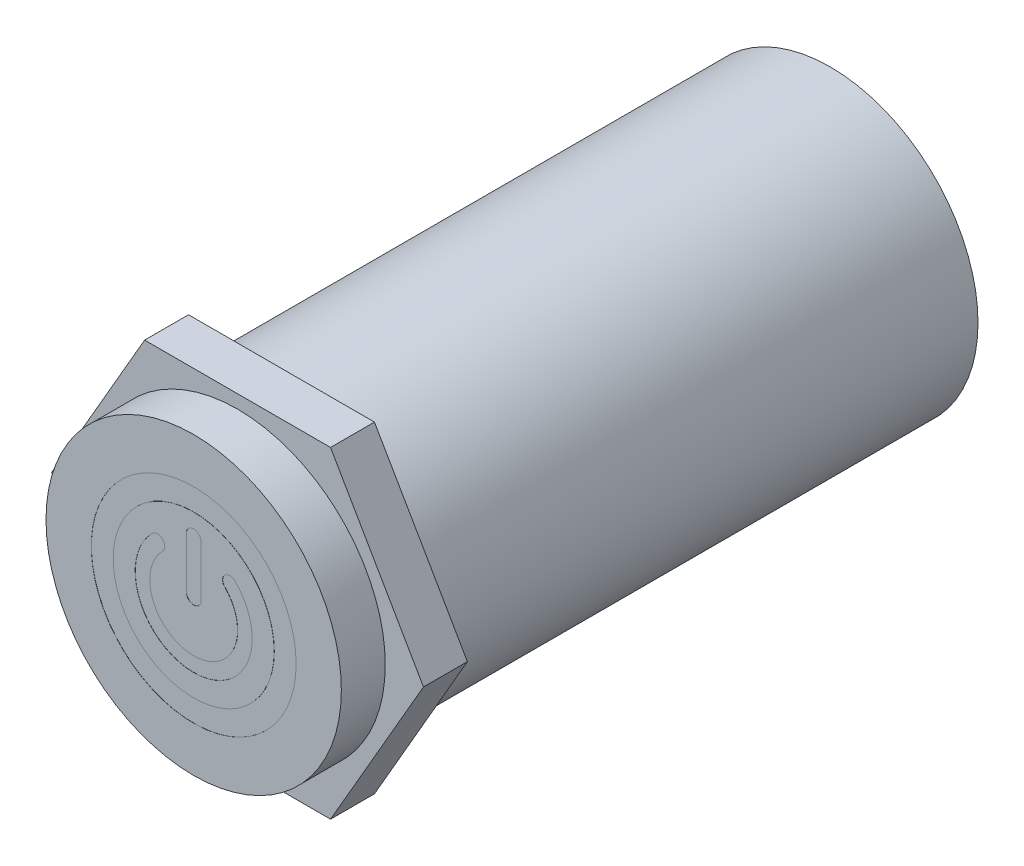
ISO-10303-21;
HEADER;
FILE_DESCRIPTION(('STEP AP214'),'2;1');
FILE_NAME('part.step','',(''),(''),'','','');
FILE_SCHEMA(('AUTOMOTIVE_DESIGN { 1 0 10303 214 1 1 1 1 }'));
ENDSEC;
DATA;
#1=APPLICATION_CONTEXT('core data for automotive mechanical design processes');
#2=APPLICATION_PROTOCOL_DEFINITION('international standard','automotive_design',2000,#1);
#3=PRODUCT_CONTEXT('',#1,'mechanical');
#4=PRODUCT('Part','Part','',(#3));
#5=PRODUCT_RELATED_PRODUCT_CATEGORY('part','',(#4));
#6=PRODUCT_DEFINITION_FORMATION('','',#4);
#7=PRODUCT_DEFINITION_CONTEXT('part definition',#1,'design');
#8=PRODUCT_DEFINITION('design','',#6,#7);
#9=PRODUCT_DEFINITION_SHAPE('','',#8);
#10=(LENGTH_UNIT() NAMED_UNIT(*) SI_UNIT(.MILLI.,.METRE.));
#11=(NAMED_UNIT(*) PLANE_ANGLE_UNIT() SI_UNIT($,.RADIAN.));
#12=(NAMED_UNIT(*) SI_UNIT($,.STERADIAN.) SOLID_ANGLE_UNIT());
#13=UNCERTAINTY_MEASURE_WITH_UNIT(LENGTH_MEASURE(1.E-05),#10,'distance_accuracy_value','');
#14=(GEOMETRIC_REPRESENTATION_CONTEXT(3) GLOBAL_UNCERTAINTY_ASSIGNED_CONTEXT((#13)) GLOBAL_UNIT_ASSIGNED_CONTEXT((#10,
#11,#12)) REPRESENTATION_CONTEXT('',''));
#15=CARTESIAN_POINT('',(0.,0.,0.));
#16=DIRECTION('',(0.,0.,1.));
#17=DIRECTION('',(1.,0.,0.));
#18=AXIS2_PLACEMENT_3D('',#15,#16,#17);
#19=CARTESIAN_POINT('',(0.,0.,6.));
#20=DIRECTION('',(0.,0.,1.));
#21=DIRECTION('',(1.,0.,0.));
#22=AXIS2_PLACEMENT_3D('',#19,#20,#21);
#23=PLANE('',#22);
#24=CARTESIAN_POINT('',(0.,0.500000000000001,6.));
#25=DIRECTION('',(0.,0.,1.));
#26=DIRECTION('',(1.,0.,0.));
#27=AXIS2_PLACEMENT_3D('',#24,#25,#26);
#28=CIRCLE('',#27,0.5);
#29=CARTESIAN_POINT('',(-0.5,0.500000000000001,6.));
#30=VERTEX_POINT('',#29);
#31=CARTESIAN_POINT('',(0.5,0.500000000000001,6.));
#32=VERTEX_POINT('',#31);
#33=EDGE_CURVE('E108',#30,#32,#28,.T.);
#34=ORIENTED_EDGE('',*,*,#33,.F.);
#35=DIRECTION('',(0.,1.,0.));
#36=VECTOR('',#35,1.);
#37=CARTESIAN_POINT('',(-0.5,0.500000000000001,6.));
#38=LINE('',#37,#36);
#39=CARTESIAN_POINT('',(-0.5,4.,6.));
#40=VERTEX_POINT('',#39);
#41=EDGE_CURVE('E204',#30,#40,#38,.T.);
#42=ORIENTED_EDGE('',*,*,#41,.T.);
#43=CARTESIAN_POINT('',(0.,4.,6.));
#44=DIRECTION('',(0.,0.,1.));
#45=DIRECTION('',(1.,0.,0.));
#46=AXIS2_PLACEMENT_3D('',#43,#44,#45);
#47=CIRCLE('',#46,0.5);
#48=CARTESIAN_POINT('',(0.5,4.,6.));
#49=VERTEX_POINT('',#48);
#50=EDGE_CURVE('E210',#49,#40,#47,.T.);
#51=ORIENTED_EDGE('',*,*,#50,.F.);
#52=DIRECTION('',(0.,-1.,0.));
#53=VECTOR('',#52,1.);
#54=CARTESIAN_POINT('',(0.5,4.,6.));
#55=LINE('',#54,#53);
#56=EDGE_CURVE('E215',#49,#32,#55,.T.);
#57=ORIENTED_EDGE('',*,*,#56,.T.);
#58=EDGE_LOOP('',(#34,#42,#51,#57));
#59=FACE_BOUND('',#58,.T.);
#60=CARTESIAN_POINT('',(0.,0.,6.));
#61=DIRECTION('',(0.,0.,1.));
#62=DIRECTION('',(1.,0.,0.));
#63=AXIS2_PLACEMENT_3D('',#60,#61,#62);
#64=CIRCLE('',#63,5.5);
#65=CARTESIAN_POINT('',(5.5,0.,6.));
#66=VERTEX_POINT('',#65);
#67=EDGE_CURVE('E249',#66,#66,#64,.T.);
#68=ORIENTED_EDGE('',*,*,#67,.T.);
#69=EDGE_LOOP('',(#68));
#70=FACE_BOUND('',#69,.T.);
#71=CARTESIAN_POINT('',(0.,0.,6.));
#72=DIRECTION('',(0.,0.,1.));
#73=DIRECTION('',(1.,0.,0.));
#74=AXIS2_PLACEMENT_3D('',#71,#72,#73);
#75=CIRCLE('',#74,4.);
#76=CARTESIAN_POINT('',(-2.82842712474618,2.8284271247462,6.));
#77=VERTEX_POINT('',#76);
#78=CARTESIAN_POINT('',(2.82842712474619,2.8284271247462,6.));
#79=VERTEX_POINT('',#78);
#80=EDGE_CURVE('E245',#77,#79,#75,.T.);
#81=ORIENTED_EDGE('',*,*,#80,.F.);
#82=CARTESIAN_POINT('',(-2.47487373415291,2.47487373415292,6.));
#83=DIRECTION('',(0.,0.,1.));
#84=DIRECTION('',(1.,0.,0.));
#85=AXIS2_PLACEMENT_3D('',#82,#83,#84);
#86=CIRCLE('',#85,0.5);
#87=CARTESIAN_POINT('',(-2.12132034355964,2.12132034355965,6.));
#88=VERTEX_POINT('',#87);
#89=EDGE_CURVE('E116',#77,#88,#86,.F.);
#90=ORIENTED_EDGE('',*,*,#89,.T.);
#91=CARTESIAN_POINT('',(0.,0.,6.));
#92=DIRECTION('',(0.,0.,1.));
#93=DIRECTION('',(1.,0.,0.));
#94=AXIS2_PLACEMENT_3D('',#91,#92,#93);
#95=CIRCLE('',#94,3.);
#96=CARTESIAN_POINT('',(2.12132034355964,2.12132034355965,6.));
#97=VERTEX_POINT('',#96);
#98=EDGE_CURVE('E238',#88,#97,#95,.T.);
#99=ORIENTED_EDGE('',*,*,#98,.T.);
#100=CARTESIAN_POINT('',(2.47487373415291,2.47487373415292,6.));
#101=DIRECTION('',(0.,0.,1.));
#102=DIRECTION('',(1.,0.,0.));
#103=AXIS2_PLACEMENT_3D('',#100,#101,#102);
#104=CIRCLE('',#103,0.5);
#105=EDGE_CURVE('E241',#79,#97,#104,.T.);
#106=ORIENTED_EDGE('',*,*,#105,.F.);
#107=EDGE_LOOP('',(#81,#90,#99,#106));
#108=FACE_BOUND('',#107,.T.);
#109=ADVANCED_FACE('F91',(#59,#70,#108),#23,.T.);
#110=CARTESIAN_POINT('',(6.35085296108588,-11.,3.));
#111=DIRECTION('',(-0.866025403784439,0.5,0.));
#112=DIRECTION('',(-0.5,-0.866025403784439,0.));
#113=AXIS2_PLACEMENT_3D('',#110,#111,#112);
#114=PLANE('',#113);
#115=DIRECTION('',(0.5,0.866025403784439,0.));
#116=VECTOR('',#115,1.);
#117=CARTESIAN_POINT('',(6.35085296108588,-11.,0.));
#118=LINE('',#117,#116);
#119=CARTESIAN_POINT('',(6.35085296108588,-11.,0.));
#120=VERTEX_POINT('',#119);
#121=CARTESIAN_POINT('',(12.7017059221718,0.,0.));
#122=VERTEX_POINT('',#121);
#123=EDGE_CURVE('E291',#120,#122,#118,.T.);
#124=ORIENTED_EDGE('',*,*,#123,.T.);
#125=DIRECTION('',(0.,0.,-1.));
#126=VECTOR('',#125,1.);
#127=CARTESIAN_POINT('',(12.7017059221718,0.,3.));
#128=LINE('',#127,#126);
#129=CARTESIAN_POINT('',(12.7017059221718,0.,3.));
#130=VERTEX_POINT('',#129);
#131=EDGE_CURVE('E100',#130,#122,#128,.T.);
#132=ORIENTED_EDGE('',*,*,#131,.F.);
#133=DIRECTION('',(0.5,0.866025403784439,0.));
#134=VECTOR('',#133,1.);
#135=CARTESIAN_POINT('',(6.35085296108588,-11.,3.));
#136=LINE('',#135,#134);
#137=CARTESIAN_POINT('',(6.35085296108588,-11.,3.));
#138=VERTEX_POINT('',#137);
#139=EDGE_CURVE('E276',#138,#130,#136,.T.);
#140=ORIENTED_EDGE('',*,*,#139,.F.);
#141=DIRECTION('',(0.,0.,-1.));
#142=VECTOR('',#141,1.);
#143=CARTESIAN_POINT('',(6.35085296108588,-11.,3.));
#144=LINE('',#143,#142);
#145=EDGE_CURVE('E290',#138,#120,#144,.T.);
#146=ORIENTED_EDGE('',*,*,#145,.T.);
#147=EDGE_LOOP('',(#124,#132,#140,#146));
#148=FACE_BOUND('',#147,.T.);
#149=ADVANCED_FACE('F93',(#148),#114,.F.);
#150=CARTESIAN_POINT('',(12.7017059221718,0.,3.));
#151=DIRECTION('',(-0.866025403784439,-0.5,0.));
#152=DIRECTION('',(0.5,-0.866025403784439,0.));
#153=AXIS2_PLACEMENT_3D('',#150,#151,#152);
#154=PLANE('',#153);
#155=DIRECTION('',(-0.5,0.866025403784439,0.));
#156=VECTOR('',#155,1.);
#157=CARTESIAN_POINT('',(12.7017059221718,0.,0.));
#158=LINE('',#157,#156);
#159=CARTESIAN_POINT('',(6.35085296108589,11.,0.));
#160=VERTEX_POINT('',#159);
#161=EDGE_CURVE('E294',#122,#160,#158,.T.);
#162=ORIENTED_EDGE('',*,*,#161,.T.);
#163=DIRECTION('',(0.,0.,-1.));
#164=VECTOR('',#163,1.);
#165=CARTESIAN_POINT('',(6.35085296108589,11.,3.));
#166=LINE('',#165,#164);
#167=CARTESIAN_POINT('',(6.35085296108589,11.,3.));
#168=VERTEX_POINT('',#167);
#169=EDGE_CURVE('E314',#168,#160,#166,.T.);
#170=ORIENTED_EDGE('',*,*,#169,.F.);
#171=DIRECTION('',(-0.5,0.866025403784439,0.));
#172=VECTOR('',#171,1.);
#173=CARTESIAN_POINT('',(12.7017059221718,0.,3.));
#174=LINE('',#173,#172);
#175=EDGE_CURVE('E279',#130,#168,#174,.T.);
#176=ORIENTED_EDGE('',*,*,#175,.F.);
#177=ORIENTED_EDGE('',*,*,#131,.T.);
#178=EDGE_LOOP('',(#162,#170,#176,#177));
#179=FACE_BOUND('',#178,.T.);
#180=ADVANCED_FACE('F319',(#179),#154,.F.);
#181=CARTESIAN_POINT('',(6.35085296108589,11.,3.));
#182=DIRECTION('',(0.,-1.,0.));
#183=DIRECTION('',(1.,0.,0.));
#184=AXIS2_PLACEMENT_3D('',#181,#182,#183);
#185=PLANE('',#184);
#186=DIRECTION('',(-1.,0.,0.));
#187=VECTOR('',#186,1.);
#188=CARTESIAN_POINT('',(6.35085296108589,11.,0.));
#189=LINE('',#188,#187);
#190=CARTESIAN_POINT('',(-6.35085296108588,11.,0.));
#191=VERTEX_POINT('',#190);
#192=EDGE_CURVE('E296',#160,#191,#189,.T.);
#193=ORIENTED_EDGE('',*,*,#192,.T.);
#194=DIRECTION('',(0.,0.,-1.));
#195=VECTOR('',#194,1.);
#196=CARTESIAN_POINT('',(-6.35085296108588,11.,3.));
#197=LINE('',#196,#195);
#198=CARTESIAN_POINT('',(-6.35085296108588,11.,3.));
#199=VERTEX_POINT('',#198);
#200=EDGE_CURVE('E311',#199,#191,#197,.T.);
#201=ORIENTED_EDGE('',*,*,#200,.F.);
#202=DIRECTION('',(-1.,0.,0.));
#203=VECTOR('',#202,1.);
#204=CARTESIAN_POINT('',(6.35085296108589,11.,3.));
#205=LINE('',#204,#203);
#206=EDGE_CURVE('E282',#168,#199,#205,.T.);
#207=ORIENTED_EDGE('',*,*,#206,.F.);
#208=ORIENTED_EDGE('',*,*,#169,.T.);
#209=EDGE_LOOP('',(#193,#201,#207,#208));
#210=FACE_BOUND('',#209,.T.);
#211=ADVANCED_FACE('F333',(#210),#185,.F.);
#212=CARTESIAN_POINT('',(-6.35085296108588,11.,3.));
#213=DIRECTION('',(0.866025403784439,-0.5,0.));
#214=DIRECTION('',(0.5,0.866025403784439,0.));
#215=AXIS2_PLACEMENT_3D('',#212,#213,#214);
#216=PLANE('',#215);
#217=DIRECTION('',(-0.5,-0.866025403784439,0.));
#218=VECTOR('',#217,1.);
#219=CARTESIAN_POINT('',(-6.35085296108588,11.,0.));
#220=LINE('',#219,#218);
#221=CARTESIAN_POINT('',(-12.7017059221718,0.,0.));
#222=VERTEX_POINT('',#221);
#223=EDGE_CURVE('E298',#191,#222,#220,.T.);
#224=ORIENTED_EDGE('',*,*,#223,.T.);
#225=DIRECTION('',(0.,0.,-1.));
#226=VECTOR('',#225,1.);
#227=CARTESIAN_POINT('',(-12.7017059221718,0.,3.));
#228=LINE('',#227,#226);
#229=CARTESIAN_POINT('',(-12.7017059221718,0.,3.));
#230=VERTEX_POINT('',#229);
#231=EDGE_CURVE('E308',#230,#222,#228,.T.);
#232=ORIENTED_EDGE('',*,*,#231,.F.);
#233=DIRECTION('',(-0.5,-0.866025403784439,0.));
#234=VECTOR('',#233,1.);
#235=CARTESIAN_POINT('',(-6.35085296108588,11.,3.));
#236=LINE('',#235,#234);
#237=EDGE_CURVE('E284',#199,#230,#236,.T.);
#238=ORIENTED_EDGE('',*,*,#237,.F.);
#239=ORIENTED_EDGE('',*,*,#200,.T.);
#240=EDGE_LOOP('',(#224,#232,#238,#239));
#241=FACE_BOUND('',#240,.T.);
#242=ADVANCED_FACE('F337',(#241),#216,.F.);
#243=CARTESIAN_POINT('',(-12.7017059221718,0.,3.));
#244=DIRECTION('',(0.866025403784439,0.5,0.));
#245=DIRECTION('',(-0.5,0.866025403784439,0.));
#246=AXIS2_PLACEMENT_3D('',#243,#244,#245);
#247=PLANE('',#246);
#248=DIRECTION('',(0.5,-0.866025403784439,0.));
#249=VECTOR('',#248,1.);
#250=CARTESIAN_POINT('',(-12.7017059221718,0.,0.));
#251=LINE('',#250,#249);
#252=CARTESIAN_POINT('',(-6.35085296108589,-11.,0.));
#253=VERTEX_POINT('',#252);
#254=EDGE_CURVE('E300',#222,#253,#251,.T.);
#255=ORIENTED_EDGE('',*,*,#254,.T.);
#256=DIRECTION('',(0.,0.,-1.));
#257=VECTOR('',#256,1.);
#258=CARTESIAN_POINT('',(-6.35085296108589,-11.,3.));
#259=LINE('',#258,#257);
#260=CARTESIAN_POINT('',(-6.35085296108589,-11.,3.));
#261=VERTEX_POINT('',#260);
#262=EDGE_CURVE('E305',#261,#253,#259,.T.);
#263=ORIENTED_EDGE('',*,*,#262,.F.);
#264=DIRECTION('',(0.5,-0.866025403784439,0.));
#265=VECTOR('',#264,1.);
#266=CARTESIAN_POINT('',(-12.7017059221718,0.,3.));
#267=LINE('',#266,#265);
#268=EDGE_CURVE('E286',#230,#261,#267,.T.);
#269=ORIENTED_EDGE('',*,*,#268,.F.);
#270=ORIENTED_EDGE('',*,*,#231,.T.);
#271=EDGE_LOOP('',(#255,#263,#269,#270));
#272=FACE_BOUND('',#271,.T.);
#273=ADVANCED_FACE('F347',(#272),#247,.F.);
#274=CARTESIAN_POINT('',(-6.35085296108589,-11.,3.));
#275=DIRECTION('',(0.,1.,0.));
#276=DIRECTION('',(0.,0.,1.));
#277=AXIS2_PLACEMENT_3D('',#274,#275,#276);
#278=PLANE('',#277);
#279=DIRECTION('',(1.,0.,0.));
#280=VECTOR('',#279,1.);
#281=CARTESIAN_POINT('',(-6.35085296108589,-11.,0.));
#282=LINE('',#281,#280);
#283=EDGE_CURVE('E280',#253,#120,#282,.T.);
#284=ORIENTED_EDGE('',*,*,#283,.T.);
#285=ORIENTED_EDGE('',*,*,#145,.F.);
#286=DIRECTION('',(1.,0.,0.));
#287=VECTOR('',#286,1.);
#288=CARTESIAN_POINT('',(-6.35085296108589,-11.,3.));
#289=LINE('',#288,#287);
#290=EDGE_CURVE('E288',#261,#138,#289,.T.);
#291=ORIENTED_EDGE('',*,*,#290,.F.);
#292=ORIENTED_EDGE('',*,*,#262,.T.);
#293=EDGE_LOOP('',(#284,#285,#291,#292));
#294=FACE_BOUND('',#293,.T.);
#295=ADVANCED_FACE('F345',(#294),#278,.F.);
#296=CARTESIAN_POINT('',(0.,0.,3.));
#297=DIRECTION('',(0.,0.,1.));
#298=DIRECTION('',(1.,0.,0.));
#299=AXIS2_PLACEMENT_3D('',#296,#297,#298);
#300=PLANE('',#299);
#301=CARTESIAN_POINT('',(0.,0.,3.));
#302=DIRECTION('',(0.,0.,1.));
#303=DIRECTION('',(1.,0.,0.));
#304=AXIS2_PLACEMENT_3D('',#301,#302,#303);
#305=CIRCLE('',#304,10.09);
#306=CARTESIAN_POINT('',(10.09,0.,3.));
#307=VERTEX_POINT('',#306);
#308=EDGE_CURVE('E12',#307,#307,#305,.T.);
#309=ORIENTED_EDGE('',*,*,#308,.F.);
#310=EDGE_LOOP('',(#309));
#311=FACE_BOUND('',#310,.T.);
#312=ORIENTED_EDGE('',*,*,#139,.T.);
#313=ORIENTED_EDGE('',*,*,#175,.T.);
#314=ORIENTED_EDGE('',*,*,#206,.T.);
#315=ORIENTED_EDGE('',*,*,#237,.T.);
#316=ORIENTED_EDGE('',*,*,#268,.T.);
#317=ORIENTED_EDGE('',*,*,#290,.T.);
#318=EDGE_LOOP('',(#312,#313,#314,#315,#316,#317));
#319=FACE_BOUND('',#318,.T.);
#320=ADVANCED_FACE('F341',(#311,#319),#300,.T.);
#321=CARTESIAN_POINT('',(0.,0.,0.));
#322=DIRECTION('',(0.,0.,1.));
#323=DIRECTION('',(1.,0.,0.));
#324=AXIS2_PLACEMENT_3D('',#321,#322,#323);
#325=PLANE('',#324);
#326=CARTESIAN_POINT('',(0.,0.,0.));
#327=DIRECTION('',(0.,0.,1.));
#328=DIRECTION('',(1.,0.,0.));
#329=AXIS2_PLACEMENT_3D('',#326,#327,#328);
#330=CIRCLE('',#329,10.09);
#331=CARTESIAN_POINT('',(10.09,0.,0.));
#332=VERTEX_POINT('',#331);
#333=EDGE_CURVE('E95',#332,#332,#330,.T.);
#334=ORIENTED_EDGE('',*,*,#333,.T.);
#335=EDGE_LOOP('',(#334));
#336=FACE_BOUND('',#335,.T.);
#337=ORIENTED_EDGE('',*,*,#123,.F.);
#338=ORIENTED_EDGE('',*,*,#283,.F.);
#339=ORIENTED_EDGE('',*,*,#254,.F.);
#340=ORIENTED_EDGE('',*,*,#223,.F.);
#341=ORIENTED_EDGE('',*,*,#192,.F.);
#342=ORIENTED_EDGE('',*,*,#161,.F.);
#343=EDGE_LOOP('',(#337,#338,#339,#340,#341,#342));
#344=FACE_BOUND('',#343,.T.);
#345=ADVANCED_FACE('F327',(#336,#344),#325,.F.);
#346=CARTESIAN_POINT('',(0.,0.,-37.5));
#347=DIRECTION('',(0.,0.,1.));
#348=DIRECTION('',(1.,0.,0.));
#349=AXIS2_PLACEMENT_3D('',#346,#347,#348);
#350=PLANE('',#349);
#351=CARTESIAN_POINT('',(0.,0.,-37.5));
#352=DIRECTION('',(0.,0.,1.));
#353=DIRECTION('',(1.,0.,0.));
#354=AXIS2_PLACEMENT_3D('',#351,#352,#353);
#355=CIRCLE('',#354,10.09);
#356=CARTESIAN_POINT('',(10.09,0.,-37.5));
#357=VERTEX_POINT('',#356);
#358=EDGE_CURVE('E273',#357,#357,#355,.T.);
#359=ORIENTED_EDGE('',*,*,#358,.F.);
#360=EDGE_LOOP('',(#359));
#361=FACE_BOUND('',#360,.T.);
#362=ADVANCED_FACE('F531',(#361),#350,.F.);
#363=CARTESIAN_POINT('',(0.,0.,-37.5));
#364=DIRECTION('',(0.,0.,1.));
#365=DIRECTION('',(1.,0.,0.));
#366=AXIS2_PLACEMENT_3D('',#363,#364,#365);
#367=CYLINDRICAL_SURFACE('',#366,10.09);
#368=ORIENTED_EDGE('',*,*,#358,.T.);
#369=EDGE_LOOP('',(#368));
#370=FACE_BOUND('',#369,.T.);
#371=ORIENTED_EDGE('',*,*,#333,.F.);
#372=EDGE_LOOP('',(#371));
#373=FACE_BOUND('',#372,.T.);
#374=ADVANCED_FACE('F374',(#370,#373),#367,.T.);
#375=ORIENTED_EDGE('',*,*,#308,.T.);
#376=EDGE_LOOP('',(#375));
#377=FACE_BOUND('',#376,.T.);
#378=CARTESIAN_POINT('',(0.,0.,6.));
#379=DIRECTION('',(0.,0.,1.));
#380=DIRECTION('',(1.,0.,0.));
#381=AXIS2_PLACEMENT_3D('',#378,#379,#380);
#382=CIRCLE('',#381,10.09);
#383=CARTESIAN_POINT('',(10.09,0.,6.));
#384=VERTEX_POINT('',#383);
#385=EDGE_CURVE('E266',#384,#384,#382,.T.);
#386=ORIENTED_EDGE('',*,*,#385,.F.);
#387=EDGE_LOOP('',(#386));
#388=FACE_BOUND('',#387,.T.);
#389=ADVANCED_FACE('F366',(#377,#388),#367,.T.);
#390=CARTESIAN_POINT('',(0.,0.,6.));
#391=DIRECTION('',(0.,0.,1.));
#392=DIRECTION('',(1.,0.,0.));
#393=AXIS2_PLACEMENT_3D('',#390,#391,#392);
#394=CIRCLE('',#393,7.);
#395=CARTESIAN_POINT('',(7.,0.,6.));
#396=VERTEX_POINT('',#395);
#397=EDGE_CURVE('E263',#396,#396,#394,.T.);
#398=ORIENTED_EDGE('',*,*,#397,.F.);
#399=EDGE_LOOP('',(#398));
#400=FACE_BOUND('',#399,.T.);
#401=ORIENTED_EDGE('',*,*,#385,.T.);
#402=EDGE_LOOP('',(#401));
#403=FACE_BOUND('',#402,.T.);
#404=ADVANCED_FACE('F358',(#400,#403),#23,.T.);
#405=CARTESIAN_POINT('',(0.,0.,5.99));
#406=DIRECTION('',(0.,0.,1.));
#407=DIRECTION('',(1.,0.,0.));
#408=AXIS2_PLACEMENT_3D('',#405,#406,#407);
#409=CYLINDRICAL_SURFACE('',#408,5.5);
#410=CARTESIAN_POINT('',(0.,0.,5.99));
#411=DIRECTION('',(0.,0.,1.));
#412=DIRECTION('',(1.,0.,0.));
#413=AXIS2_PLACEMENT_3D('',#410,#411,#412);
#414=CIRCLE('',#413,5.5);
#415=CARTESIAN_POINT('',(5.5,0.,5.99));
#416=VERTEX_POINT('',#415);
#417=EDGE_CURVE('E259',#416,#416,#414,.T.);
#418=CARTESIAN_POINT('',(5.5,0.,5.99));
#419=CARTESIAN_POINT('',(5.5,0.,5.99010416666667));
#420=CARTESIAN_POINT('',(5.5,0.,5.99020833333333));
#421=CARTESIAN_POINT('',(5.5,0.,5.99041666666667));
#422=CARTESIAN_POINT('',(5.5,0.,5.99052083333333));
#423=CARTESIAN_POINT('',(5.5,0.,5.99072916666667));
#424=CARTESIAN_POINT('',(5.5,0.,5.99083333333333));
#425=CARTESIAN_POINT('',(5.5,0.,5.99104166666667));
#426=CARTESIAN_POINT('',(5.5,0.,5.99114583333333));
#427=CARTESIAN_POINT('',(5.5,0.,5.99135416666667));
#428=CARTESIAN_POINT('',(5.5,0.,5.99145833333333));
#429=CARTESIAN_POINT('',(5.5,0.,5.99166666666667));
#430=CARTESIAN_POINT('',(5.5,0.,5.99177083333333));
#431=CARTESIAN_POINT('',(5.5,0.,5.99197916666667));
#432=CARTESIAN_POINT('',(5.5,0.,5.99208333333333));
#433=CARTESIAN_POINT('',(5.5,0.,5.99229166666667));
#434=CARTESIAN_POINT('',(5.5,0.,5.99239583333333));
#435=CARTESIAN_POINT('',(5.5,0.,5.99260416666667));
#436=CARTESIAN_POINT('',(5.5,0.,5.99270833333333));
#437=CARTESIAN_POINT('',(5.5,0.,5.99291666666667));
#438=CARTESIAN_POINT('',(5.5,0.,5.99302083333333));
#439=CARTESIAN_POINT('',(5.5,0.,5.99322916666667));
#440=CARTESIAN_POINT('',(5.5,0.,5.99333333333333));
#441=CARTESIAN_POINT('',(5.5,0.,5.99354166666667));
#442=CARTESIAN_POINT('',(5.5,0.,5.99364583333333));
#443=CARTESIAN_POINT('',(5.5,0.,5.99385416666667));
#444=CARTESIAN_POINT('',(5.5,0.,5.99395833333333));
#445=CARTESIAN_POINT('',(5.5,0.,5.99416666666667));
#446=CARTESIAN_POINT('',(5.5,0.,5.99427083333333));
#447=CARTESIAN_POINT('',(5.5,0.,5.99447916666667));
#448=CARTESIAN_POINT('',(5.5,0.,5.99458333333333));
#449=CARTESIAN_POINT('',(5.5,0.,5.99479166666667));
#450=CARTESIAN_POINT('',(5.5,0.,5.99489583333333));
#451=CARTESIAN_POINT('',(5.5,0.,5.99510416666667));
#452=CARTESIAN_POINT('',(5.5,0.,5.99520833333333));
#453=CARTESIAN_POINT('',(5.5,0.,5.99541666666667));
#454=CARTESIAN_POINT('',(5.5,0.,5.99552083333333));
#455=CARTESIAN_POINT('',(5.5,0.,5.99572916666667));
#456=CARTESIAN_POINT('',(5.5,0.,5.99583333333333));
#457=CARTESIAN_POINT('',(5.5,0.,5.99604166666667));
#458=CARTESIAN_POINT('',(5.5,0.,5.99614583333333));
#459=CARTESIAN_POINT('',(5.5,0.,5.99635416666667));
#460=CARTESIAN_POINT('',(5.5,0.,5.99645833333333));
#461=CARTESIAN_POINT('',(5.5,0.,5.99666666666667));
#462=CARTESIAN_POINT('',(5.5,0.,5.99677083333333));
#463=CARTESIAN_POINT('',(5.5,0.,5.99697916666667));
#464=CARTESIAN_POINT('',(5.5,0.,5.99708333333333));
#465=CARTESIAN_POINT('',(5.5,0.,5.99729166666667));
#466=CARTESIAN_POINT('',(5.5,0.,5.99739583333333));
#467=CARTESIAN_POINT('',(5.5,0.,5.99760416666667));
#468=CARTESIAN_POINT('',(5.5,0.,5.99770833333333));
#469=CARTESIAN_POINT('',(5.5,0.,5.99791666666667));
#470=CARTESIAN_POINT('',(5.5,0.,5.99802083333333));
#471=CARTESIAN_POINT('',(5.5,0.,5.99822916666667));
#472=CARTESIAN_POINT('',(5.5,0.,5.99833333333333));
#473=CARTESIAN_POINT('',(5.5,0.,5.99854166666667));
#474=CARTESIAN_POINT('',(5.5,0.,5.99864583333333));
#475=CARTESIAN_POINT('',(5.5,0.,5.99885416666667));
#476=CARTESIAN_POINT('',(5.5,0.,5.99895833333333));
#477=CARTESIAN_POINT('',(5.5,0.,5.99916666666667));
#478=CARTESIAN_POINT('',(5.5,0.,5.99927083333333));
#479=CARTESIAN_POINT('',(5.5,0.,5.99947916666667));
#480=CARTESIAN_POINT('',(5.5,0.,5.99958333333333));
#481=CARTESIAN_POINT('',(5.5,0.,5.99979166666667));
#482=CARTESIAN_POINT('',(5.5,0.,5.99989583333333));
#483=CARTESIAN_POINT('',(5.5,0.,6.));
#484=B_SPLINE_CURVE_WITH_KNOTS('',3,(#418,#419,#420,#421,#422,#423,#424,#425,#426,#427,#428,
#429,#430,#431,#432,#433,#434,#435,#436,#437,#438,#439,#440,#441,#442,#443,#444,#445,#446,#447,
#448,#449,#450,#451,#452,#453,#454,#455,#456,#457,#458,#459,#460,#461,#462,#463,#464,#465,#466,
#467,#468,#469,#470,#471,#472,#473,#474,#475,#476,#477,#478,#479,#480,#481,#482,#483),
.UNSPECIFIED.,.F.,.F.,(4,2,2,2,2,2,2,2,2,2,2,2,2,2,2,2,2,2,2,2,2,2,2,2,2,2,2,2,2,2,2,2,4),(0.,
0.000312499999999445,0.000624999999999758,0.000937499999999203,0.00124999999999952,
0.00156249999999983,0.00187499999999927,0.00218749999999959,0.00249999999999903,
0.00281249999999934,0.00312499999999966,0.0034374999999991,0.00374999999999941,
0.00406249999999973,0.00437499999999917,0.00468749999999948,0.00499999999999893,
0.00531249999999924,0.00562499999999955,0.005937499999999,0.00624999999999931,
0.00656249999999962,0.00687499999999907,0.00718749999999938,0.00749999999999883,
0.00781249999999914,0.00812499999999945,0.0084374999999989,0.00874999999999921,
0.00906249999999952,0.00937499999999897,0.00968749999999928,0.00999999999999873),.UNSPECIFIED.);
#485=EDGE_CURVE('BSEAM365',#416,#66,#484,.T.);
#486=ORIENTED_EDGE('',*,*,#417,.T.);
#487=ORIENTED_EDGE('',*,*,#67,.F.);
#488=ORIENTED_EDGE('',*,*,#485,.T.);
#489=ORIENTED_EDGE('',*,*,#485,.F.);
#490=EDGE_LOOP('',(#486,#488,#487,#489));
#491=FACE_BOUND('',#490,.T.);
#492=ADVANCED_FACE('F365',(#491),#409,.T.);
#493=CARTESIAN_POINT('',(0.,0.,5.99));
#494=DIRECTION('',(0.,0.,1.));
#495=DIRECTION('',(1.,0.,0.));
#496=AXIS2_PLACEMENT_3D('',#493,#494,#495);
#497=CYLINDRICAL_SURFACE('',#496,7.);
#498=CARTESIAN_POINT('',(0.,0.,5.99));
#499=DIRECTION('',(0.,0.,1.));
#500=DIRECTION('',(1.,0.,0.));
#501=AXIS2_PLACEMENT_3D('',#498,#499,#500);
#502=CIRCLE('',#501,7.);
#503=CARTESIAN_POINT('',(7.,0.,5.99));
#504=VERTEX_POINT('',#503);
#505=EDGE_CURVE('E262',#504,#504,#502,.T.);
#506=CARTESIAN_POINT('',(7.,0.,5.99));
#507=CARTESIAN_POINT('',(7.,0.,5.99010416666667));
#508=CARTESIAN_POINT('',(7.,0.,5.99020833333333));
#509=CARTESIAN_POINT('',(7.,0.,5.99041666666667));
#510=CARTESIAN_POINT('',(7.,0.,5.99052083333333));
#511=CARTESIAN_POINT('',(7.,0.,5.99072916666667));
#512=CARTESIAN_POINT('',(7.,0.,5.99083333333333));
#513=CARTESIAN_POINT('',(7.,0.,5.99104166666667));
#514=CARTESIAN_POINT('',(7.,0.,5.99114583333333));
#515=CARTESIAN_POINT('',(7.,0.,5.99135416666667));
#516=CARTESIAN_POINT('',(7.,0.,5.99145833333333));
#517=CARTESIAN_POINT('',(7.,0.,5.99166666666667));
#518=CARTESIAN_POINT('',(7.,0.,5.99177083333333));
#519=CARTESIAN_POINT('',(7.,0.,5.99197916666667));
#520=CARTESIAN_POINT('',(7.,0.,5.99208333333333));
#521=CARTESIAN_POINT('',(7.,0.,5.99229166666667));
#522=CARTESIAN_POINT('',(7.,0.,5.99239583333333));
#523=CARTESIAN_POINT('',(7.,0.,5.99260416666667));
#524=CARTESIAN_POINT('',(7.,0.,5.99270833333333));
#525=CARTESIAN_POINT('',(7.,0.,5.99291666666667));
#526=CARTESIAN_POINT('',(7.,0.,5.99302083333333));
#527=CARTESIAN_POINT('',(7.,0.,5.99322916666667));
#528=CARTESIAN_POINT('',(7.,0.,5.99333333333333));
#529=CARTESIAN_POINT('',(7.,0.,5.99354166666667));
#530=CARTESIAN_POINT('',(7.,0.,5.99364583333333));
#531=CARTESIAN_POINT('',(7.,0.,5.99385416666667));
#532=CARTESIAN_POINT('',(7.,0.,5.99395833333333));
#533=CARTESIAN_POINT('',(7.,0.,5.99416666666667));
#534=CARTESIAN_POINT('',(7.,0.,5.99427083333333));
#535=CARTESIAN_POINT('',(7.,0.,5.99447916666667));
#536=CARTESIAN_POINT('',(7.,0.,5.99458333333333));
#537=CARTESIAN_POINT('',(7.,0.,5.99479166666667));
#538=CARTESIAN_POINT('',(7.,0.,5.99489583333333));
#539=CARTESIAN_POINT('',(7.,0.,5.99510416666667));
#540=CARTESIAN_POINT('',(7.,0.,5.99520833333333));
#541=CARTESIAN_POINT('',(7.,0.,5.99541666666667));
#542=CARTESIAN_POINT('',(7.,0.,5.99552083333333));
#543=CARTESIAN_POINT('',(7.,0.,5.99572916666667));
#544=CARTESIAN_POINT('',(7.,0.,5.99583333333333));
#545=CARTESIAN_POINT('',(7.,0.,5.99604166666667));
#546=CARTESIAN_POINT('',(7.,0.,5.99614583333333));
#547=CARTESIAN_POINT('',(7.,0.,5.99635416666667));
#548=CARTESIAN_POINT('',(7.,0.,5.99645833333333));
#549=CARTESIAN_POINT('',(7.,0.,5.99666666666667));
#550=CARTESIAN_POINT('',(7.,0.,5.99677083333333));
#551=CARTESIAN_POINT('',(7.,0.,5.99697916666667));
#552=CARTESIAN_POINT('',(7.,0.,5.99708333333333));
#553=CARTESIAN_POINT('',(7.,0.,5.99729166666667));
#554=CARTESIAN_POINT('',(7.,0.,5.99739583333333));
#555=CARTESIAN_POINT('',(7.,0.,5.99760416666667));
#556=CARTESIAN_POINT('',(7.,0.,5.99770833333333));
#557=CARTESIAN_POINT('',(7.,0.,5.99791666666667));
#558=CARTESIAN_POINT('',(7.,0.,5.99802083333333));
#559=CARTESIAN_POINT('',(7.,0.,5.99822916666667));
#560=CARTESIAN_POINT('',(7.,0.,5.99833333333333));
#561=CARTESIAN_POINT('',(7.,0.,5.99854166666667));
#562=CARTESIAN_POINT('',(7.,0.,5.99864583333333));
#563=CARTESIAN_POINT('',(7.,0.,5.99885416666667));
#564=CARTESIAN_POINT('',(7.,0.,5.99895833333333));
#565=CARTESIAN_POINT('',(7.,0.,5.99916666666667));
#566=CARTESIAN_POINT('',(7.,0.,5.99927083333333));
#567=CARTESIAN_POINT('',(7.,0.,5.99947916666667));
#568=CARTESIAN_POINT('',(7.,0.,5.99958333333333));
#569=CARTESIAN_POINT('',(7.,0.,5.99979166666667));
#570=CARTESIAN_POINT('',(7.,0.,5.99989583333333));
#571=CARTESIAN_POINT('',(7.,0.,6.));
#572=B_SPLINE_CURVE_WITH_KNOTS('',3,(#506,#507,#508,#509,#510,#511,#512,#513,#514,#515,#516,
#517,#518,#519,#520,#521,#522,#523,#524,#525,#526,#527,#528,#529,#530,#531,#532,#533,#534,#535,
#536,#537,#538,#539,#540,#541,#542,#543,#544,#545,#546,#547,#548,#549,#550,#551,#552,#553,#554,
#555,#556,#557,#558,#559,#560,#561,#562,#563,#564,#565,#566,#567,#568,#569,#570,#571),
.UNSPECIFIED.,.F.,.F.,(4,2,2,2,2,2,2,2,2,2,2,2,2,2,2,2,2,2,2,2,2,2,2,2,2,2,2,2,2,2,2,2,4),(0.,
0.000312499999999445,0.000624999999999758,0.000937499999999203,0.00124999999999952,
0.00156249999999983,0.00187499999999927,0.00218749999999959,0.00249999999999903,
0.00281249999999934,0.00312499999999966,0.0034374999999991,0.00374999999999941,
0.00406249999999973,0.00437499999999917,0.00468749999999948,0.00499999999999893,
0.00531249999999924,0.00562499999999955,0.005937499999999,0.00624999999999931,
0.00656249999999962,0.00687499999999907,0.00718749999999938,0.00749999999999883,
0.00781249999999914,0.00812499999999945,0.0084374999999989,0.00874999999999921,
0.00906249999999952,0.00937499999999897,0.00968749999999928,0.00999999999999873),.UNSPECIFIED.);
#573=EDGE_CURVE('BSEAM372',#504,#396,#572,.T.);
#574=ORIENTED_EDGE('',*,*,#505,.F.);
#575=ORIENTED_EDGE('',*,*,#397,.T.);
#576=ORIENTED_EDGE('',*,*,#573,.T.);
#577=ORIENTED_EDGE('',*,*,#573,.F.);
#578=EDGE_LOOP('',(#574,#576,#575,#577));
#579=FACE_BOUND('',#578,.T.);
#580=ADVANCED_FACE('F372',(#579),#497,.F.);
#581=CARTESIAN_POINT('',(0.,0.,5.99));
#582=DIRECTION('',(0.,0.,1.));
#583=DIRECTION('',(1.,0.,0.));
#584=AXIS2_PLACEMENT_3D('',#581,#582,#583);
#585=PLANE('',#584);
#586=ORIENTED_EDGE('',*,*,#417,.F.);
#587=EDGE_LOOP('',(#586));
#588=FACE_BOUND('',#587,.T.);
#589=ORIENTED_EDGE('',*,*,#505,.T.);
#590=EDGE_LOOP('',(#589));
#591=FACE_BOUND('',#590,.T.);
#592=ADVANCED_FACE('F383',(#588,#591),#585,.T.);
#593=CARTESIAN_POINT('',(-2.47487373415291,2.47487373415292,5.99));
#594=DIRECTION('',(0.,0.,1.));
#595=DIRECTION('',(1.,0.,0.));
#596=AXIS2_PLACEMENT_3D('',#593,#594,#595);
#597=CYLINDRICAL_SURFACE('',#596,0.5);
#598=ORIENTED_EDGE('',*,*,#89,.F.);
#599=DIRECTION('',(0.,0.,1.));
#600=VECTOR('',#599,1.);
#601=CARTESIAN_POINT('',(-2.82842712474618,2.8284271247462,5.99));
#602=LINE('',#601,#600);
#603=CARTESIAN_POINT('',(-2.82842712474618,2.8284271247462,5.99));
#604=VERTEX_POINT('',#603);
#605=EDGE_CURVE('E232',#604,#77,#602,.T.);
#606=ORIENTED_EDGE('',*,*,#605,.F.);
#607=CARTESIAN_POINT('',(-2.47487373415291,2.47487373415292,5.99));
#608=DIRECTION('',(0.,0.,1.));
#609=DIRECTION('',(1.,0.,0.));
#610=AXIS2_PLACEMENT_3D('',#607,#608,#609);
#611=CIRCLE('',#610,0.5);
#612=CARTESIAN_POINT('',(-2.12132034355964,2.12132034355965,5.99));
#613=VERTEX_POINT('',#612);
#614=EDGE_CURVE('E242',#604,#613,#611,.F.);
#615=ORIENTED_EDGE('',*,*,#614,.T.);
#616=DIRECTION('',(0.,0.,1.));
#617=VECTOR('',#616,1.);
#618=CARTESIAN_POINT('',(-2.12132034355964,2.12132034355965,5.99));
#619=LINE('',#618,#617);
#620=EDGE_CURVE('E216',#613,#88,#619,.T.);
#621=ORIENTED_EDGE('',*,*,#620,.T.);
#622=EDGE_LOOP('',(#598,#606,#615,#621));
#623=FACE_BOUND('',#622,.T.);
#624=ADVANCED_FACE('F389',(#623),#597,.F.);
#625=CARTESIAN_POINT('',(0.,0.,5.99));
#626=DIRECTION('',(0.,0.,1.));
#627=DIRECTION('',(1.,0.,0.));
#628=AXIS2_PLACEMENT_3D('',#625,#626,#627);
#629=CYLINDRICAL_SURFACE('',#628,3.);
#630=ORIENTED_EDGE('',*,*,#98,.F.);
#631=ORIENTED_EDGE('',*,*,#620,.F.);
#632=CARTESIAN_POINT('',(0.,0.,5.99));
#633=DIRECTION('',(0.,0.,1.));
#634=DIRECTION('',(1.,0.,0.));
#635=AXIS2_PLACEMENT_3D('',#632,#633,#634);
#636=CIRCLE('',#635,3.);
#637=CARTESIAN_POINT('',(2.12132034355964,2.12132034355965,5.99));
#638=VERTEX_POINT('',#637);
#639=EDGE_CURVE('E234',#613,#638,#636,.T.);
#640=ORIENTED_EDGE('',*,*,#639,.T.);
#641=DIRECTION('',(0.,0.,1.));
#642=VECTOR('',#641,1.);
#643=CARTESIAN_POINT('',(2.12132034355964,2.12132034355965,5.99));
#644=LINE('',#643,#642);
#645=EDGE_CURVE('E218',#638,#97,#644,.T.);
#646=ORIENTED_EDGE('',*,*,#645,.T.);
#647=EDGE_LOOP('',(#630,#631,#640,#646));
#648=FACE_BOUND('',#647,.T.);
#649=ADVANCED_FACE('F399',(#648),#629,.T.);
#650=CARTESIAN_POINT('',(2.47487373415291,2.47487373415292,5.99));
#651=DIRECTION('',(0.,0.,1.));
#652=DIRECTION('',(1.,0.,0.));
#653=AXIS2_PLACEMENT_3D('',#650,#651,#652);
#654=CYLINDRICAL_SURFACE('',#653,0.5);
#655=ORIENTED_EDGE('',*,*,#105,.T.);
#656=ORIENTED_EDGE('',*,*,#645,.F.);
#657=CARTESIAN_POINT('',(2.47487373415291,2.47487373415292,5.99));
#658=DIRECTION('',(0.,0.,1.));
#659=DIRECTION('',(1.,0.,0.));
#660=AXIS2_PLACEMENT_3D('',#657,#658,#659);
#661=CIRCLE('',#660,0.5);
#662=CARTESIAN_POINT('',(2.82842712474619,2.8284271247462,5.99));
#663=VERTEX_POINT('',#662);
#664=EDGE_CURVE('E251',#663,#638,#661,.T.);
#665=ORIENTED_EDGE('',*,*,#664,.F.);
#666=DIRECTION('',(0.,0.,1.));
#667=VECTOR('',#666,1.);
#668=CARTESIAN_POINT('',(2.82842712474619,2.8284271247462,5.99));
#669=LINE('',#668,#667);
#670=EDGE_CURVE('E235',#663,#79,#669,.T.);
#671=ORIENTED_EDGE('',*,*,#670,.T.);
#672=EDGE_LOOP('',(#655,#656,#665,#671));
#673=FACE_BOUND('',#672,.T.);
#674=ADVANCED_FACE('F402',(#673),#654,.F.);
#675=CARTESIAN_POINT('',(0.,0.,5.99));
#676=DIRECTION('',(0.,0.,1.));
#677=DIRECTION('',(1.,0.,0.));
#678=AXIS2_PLACEMENT_3D('',#675,#676,#677);
#679=CYLINDRICAL_SURFACE('',#678,4.);
#680=ORIENTED_EDGE('',*,*,#80,.T.);
#681=ORIENTED_EDGE('',*,*,#670,.F.);
#682=CARTESIAN_POINT('',(0.,0.,5.99));
#683=DIRECTION('',(0.,0.,1.));
#684=DIRECTION('',(1.,0.,0.));
#685=AXIS2_PLACEMENT_3D('',#682,#683,#684);
#686=CIRCLE('',#685,4.);
#687=EDGE_CURVE('E254',#604,#663,#686,.T.);
#688=ORIENTED_EDGE('',*,*,#687,.F.);
#689=ORIENTED_EDGE('',*,*,#605,.T.);
#690=EDGE_LOOP('',(#680,#681,#688,#689));
#691=FACE_BOUND('',#690,.T.);
#692=ADVANCED_FACE('F397',(#691),#679,.F.);
#693=CARTESIAN_POINT('',(0.,0.,5.99));
#694=DIRECTION('',(0.,0.,1.));
#695=DIRECTION('',(1.,0.,0.));
#696=AXIS2_PLACEMENT_3D('',#693,#694,#695);
#697=PLANE('',#696);
#698=ORIENTED_EDGE('',*,*,#614,.F.);
#699=ORIENTED_EDGE('',*,*,#687,.T.);
#700=ORIENTED_EDGE('',*,*,#664,.T.);
#701=ORIENTED_EDGE('',*,*,#639,.F.);
#702=EDGE_LOOP('',(#698,#699,#700,#701));
#703=FACE_BOUND('',#702,.T.);
#704=ADVANCED_FACE('F394',(#703),#697,.T.);
#705=CARTESIAN_POINT('',(0.,0.500000000000001,5.99));
#706=DIRECTION('',(0.,0.,1.));
#707=DIRECTION('',(1.,0.,0.));
#708=AXIS2_PLACEMENT_3D('',#705,#706,#707);
#709=CYLINDRICAL_SURFACE('',#708,0.5);
#710=ORIENTED_EDGE('',*,*,#33,.T.);
#711=DIRECTION('',(0.,0.,1.));
#712=VECTOR('',#711,1.);
#713=CARTESIAN_POINT('',(0.5,0.500000000000001,5.99));
#714=LINE('',#713,#712);
#715=CARTESIAN_POINT('',(0.5,0.500000000000001,5.99));
#716=VERTEX_POINT('',#715);
#717=EDGE_CURVE('E226',#716,#32,#714,.T.);
#718=ORIENTED_EDGE('',*,*,#717,.F.);
#719=CARTESIAN_POINT('',(0.,0.500000000000001,5.99));
#720=DIRECTION('',(0.,0.,1.));
#721=DIRECTION('',(1.,0.,0.));
#722=AXIS2_PLACEMENT_3D('',#719,#720,#721);
#723=CIRCLE('',#722,0.5);
#724=CARTESIAN_POINT('',(-0.5,0.500000000000001,5.99));
#725=VERTEX_POINT('',#724);
#726=EDGE_CURVE('E198',#725,#716,#723,.T.);
#727=ORIENTED_EDGE('',*,*,#726,.F.);
#728=DIRECTION('',(0.,0.,1.));
#729=VECTOR('',#728,1.);
#730=CARTESIAN_POINT('',(-0.5,0.500000000000001,5.99));
#731=LINE('',#730,#729);
#732=EDGE_CURVE('E194',#725,#30,#731,.T.);
#733=ORIENTED_EDGE('',*,*,#732,.T.);
#734=EDGE_LOOP('',(#710,#718,#727,#733));
#735=FACE_BOUND('',#734,.T.);
#736=ADVANCED_FACE('F196',(#735),#709,.F.);
#737=CARTESIAN_POINT('',(-0.5,0.500000000000001,5.99));
#738=DIRECTION('',(1.,0.,0.));
#739=DIRECTION('',(0.,0.,-1.));
#740=AXIS2_PLACEMENT_3D('',#737,#738,#739);
#741=PLANE('',#740);
#742=ORIENTED_EDGE('',*,*,#41,.F.);
#743=ORIENTED_EDGE('',*,*,#732,.F.);
#744=DIRECTION('',(0.,1.,0.));
#745=VECTOR('',#744,1.);
#746=CARTESIAN_POINT('',(-0.5,0.500000000000001,5.99));
#747=LINE('',#746,#745);
#748=CARTESIAN_POINT('',(-0.5,4.,5.99));
#749=VERTEX_POINT('',#748);
#750=EDGE_CURVE('E223',#725,#749,#747,.T.);
#751=ORIENTED_EDGE('',*,*,#750,.T.);
#752=DIRECTION('',(0.,0.,1.));
#753=VECTOR('',#752,1.);
#754=CARTESIAN_POINT('',(-0.5,4.,5.99));
#755=LINE('',#754,#753);
#756=EDGE_CURVE('E201',#749,#40,#755,.T.);
#757=ORIENTED_EDGE('',*,*,#756,.T.);
#758=EDGE_LOOP('',(#742,#743,#751,#757));
#759=FACE_BOUND('',#758,.T.);
#760=ADVANCED_FACE('F205',(#759),#741,.T.);
#761=CARTESIAN_POINT('',(0.,4.,5.99));
#762=DIRECTION('',(0.,0.,1.));
#763=DIRECTION('',(1.,0.,0.));
#764=AXIS2_PLACEMENT_3D('',#761,#762,#763);
#765=CYLINDRICAL_SURFACE('',#764,0.5);
#766=ORIENTED_EDGE('',*,*,#50,.T.);
#767=ORIENTED_EDGE('',*,*,#756,.F.);
#768=CARTESIAN_POINT('',(0.,4.,5.99));
#769=DIRECTION('',(0.,0.,1.));
#770=DIRECTION('',(1.,0.,0.));
#771=AXIS2_PLACEMENT_3D('',#768,#769,#770);
#772=CIRCLE('',#771,0.5);
#773=CARTESIAN_POINT('',(0.5,4.,5.99));
#774=VERTEX_POINT('',#773);
#775=EDGE_CURVE('E225',#774,#749,#772,.T.);
#776=ORIENTED_EDGE('',*,*,#775,.F.);
#777=DIRECTION('',(0.,0.,1.));
#778=VECTOR('',#777,1.);
#779=CARTESIAN_POINT('',(0.5,4.,5.99));
#780=LINE('',#779,#778);
#781=EDGE_CURVE('E606',#774,#49,#780,.T.);
#782=ORIENTED_EDGE('',*,*,#781,.T.);
#783=EDGE_LOOP('',(#766,#767,#776,#782));
#784=FACE_BOUND('',#783,.T.);
#785=ADVANCED_FACE('F419',(#784),#765,.F.);
#786=CARTESIAN_POINT('',(0.5,4.,5.99));
#787=DIRECTION('',(-1.,0.,0.));
#788=DIRECTION('',(0.,-1.,0.));
#789=AXIS2_PLACEMENT_3D('',#786,#787,#788);
#790=PLANE('',#789);
#791=ORIENTED_EDGE('',*,*,#56,.F.);
#792=ORIENTED_EDGE('',*,*,#781,.F.);
#793=DIRECTION('',(0.,-1.,0.));
#794=VECTOR('',#793,1.);
#795=CARTESIAN_POINT('',(0.5,4.,5.99));
#796=LINE('',#795,#794);
#797=EDGE_CURVE('E229',#774,#716,#796,.T.);
#798=ORIENTED_EDGE('',*,*,#797,.T.);
#799=ORIENTED_EDGE('',*,*,#717,.T.);
#800=EDGE_LOOP('',(#791,#792,#798,#799));
#801=FACE_BOUND('',#800,.T.);
#802=ADVANCED_FACE('F415',(#801),#790,.T.);
#803=CARTESIAN_POINT('',(0.,0.500000000000001,5.99));
#804=DIRECTION('',(0.,0.,1.));
#805=DIRECTION('',(1.,0.,0.));
#806=AXIS2_PLACEMENT_3D('',#803,#804,#805);
#807=PLANE('',#806);
#808=ORIENTED_EDGE('',*,*,#726,.T.);
#809=ORIENTED_EDGE('',*,*,#797,.F.);
#810=ORIENTED_EDGE('',*,*,#775,.T.);
#811=ORIENTED_EDGE('',*,*,#750,.F.);
#812=EDGE_LOOP('',(#808,#809,#810,#811));
#813=FACE_BOUND('',#812,.T.);
#814=ADVANCED_FACE('F412',(#813),#807,.T.);
#815=CLOSED_SHELL('',(#109,#149,#180,#211,#242,#273,#295,#320,#345,#362,#374,#389,#404,#492,
#580,#592,#624,#649,#674,#692,#704,#736,#760,#785,#802,#814));
#816=MANIFOLD_SOLID_BREP('B2',#815);
#817=ADVANCED_BREP_SHAPE_REPRESENTATION('',(#18,#816),#14);
#818=SHAPE_DEFINITION_REPRESENTATION(#9,#817);
ENDSEC;
END-ISO-10303-21;
